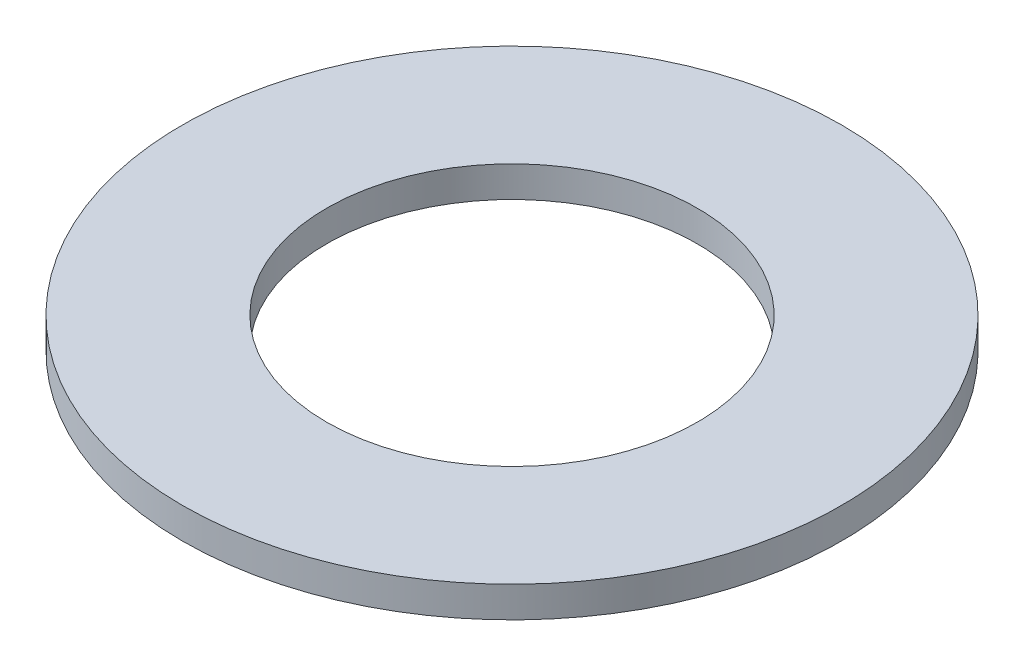
ISO-10303-21;
HEADER;
FILE_DESCRIPTION(('STEP AP214'),'2;1');
FILE_NAME('part.step','',(''),(''),'','','');
FILE_SCHEMA(('AUTOMOTIVE_DESIGN { 1 0 10303 214 1 1 1 1 }'));
ENDSEC;
DATA;
#1=APPLICATION_CONTEXT('core data for automotive mechanical design processes');
#2=APPLICATION_PROTOCOL_DEFINITION('international standard','automotive_design',2000,#1);
#3=PRODUCT_CONTEXT('',#1,'mechanical');
#4=PRODUCT('Part','Part','',(#3));
#5=PRODUCT_RELATED_PRODUCT_CATEGORY('part','',(#4));
#6=PRODUCT_DEFINITION_FORMATION('','',#4);
#7=PRODUCT_DEFINITION_CONTEXT('part definition',#1,'design');
#8=PRODUCT_DEFINITION('design','',#6,#7);
#9=PRODUCT_DEFINITION_SHAPE('','',#8);
#10=(LENGTH_UNIT() NAMED_UNIT(*) SI_UNIT(.MILLI.,.METRE.));
#11=(NAMED_UNIT(*) PLANE_ANGLE_UNIT() SI_UNIT($,.RADIAN.));
#12=(NAMED_UNIT(*) SI_UNIT($,.STERADIAN.) SOLID_ANGLE_UNIT());
#13=UNCERTAINTY_MEASURE_WITH_UNIT(LENGTH_MEASURE(1.E-05),#10,'distance_accuracy_value','');
#14=(GEOMETRIC_REPRESENTATION_CONTEXT(3) GLOBAL_UNCERTAINTY_ASSIGNED_CONTEXT((#13)) GLOBAL_UNIT_ASSIGNED_CONTEXT((#10,
#11,#12)) REPRESENTATION_CONTEXT('',''));
#15=CARTESIAN_POINT('',(0.,0.,0.));
#16=DIRECTION('',(0.,0.,1.));
#17=DIRECTION('',(1.,0.,0.));
#18=AXIS2_PLACEMENT_3D('',#15,#16,#17);
#19=CARTESIAN_POINT('',(0.,1.5,0.));
#20=DIRECTION('',(0.,1.,0.));
#21=DIRECTION('',(0.,0.,1.));
#22=AXIS2_PLACEMENT_3D('',#19,#20,#21);
#23=PLANE('',#22);
#24=CARTESIAN_POINT('',(0.,1.5,0.));
#25=DIRECTION('',(0.,1.,0.));
#26=DIRECTION('',(0.,0.,1.));
#27=AXIS2_PLACEMENT_3D('',#24,#25,#26);
#28=CIRCLE('',#27,16.);
#29=CARTESIAN_POINT('',(0.,1.5,16.));
#30=VERTEX_POINT('',#29);
#31=EDGE_CURVE('E10',#30,#30,#28,.T.);
#32=ORIENTED_EDGE('',*,*,#31,.T.);
#33=EDGE_LOOP('',(#32));
#34=FACE_BOUND('',#33,.T.);
#35=CARTESIAN_POINT('',(0.,1.5,0.));
#36=DIRECTION('',(0.,1.,0.));
#37=DIRECTION('',(0.,0.,1.));
#38=AXIS2_PLACEMENT_3D('',#35,#36,#37);
#39=CIRCLE('',#38,9.);
#40=CARTESIAN_POINT('',(0.,1.5,9.));
#41=VERTEX_POINT('',#40);
#42=EDGE_CURVE('E56',#41,#41,#39,.T.);
#43=ORIENTED_EDGE('',*,*,#42,.F.);
#44=EDGE_LOOP('',(#43));
#45=FACE_BOUND('',#44,.T.);
#46=ADVANCED_FACE('F43',(#34,#45),#23,.T.);
#47=CARTESIAN_POINT('',(0.,0.,0.));
#48=DIRECTION('',(0.,1.,0.));
#49=DIRECTION('',(0.,0.,1.));
#50=AXIS2_PLACEMENT_3D('',#47,#48,#49);
#51=PLANE('',#50);
#52=CARTESIAN_POINT('',(0.,0.,0.));
#53=DIRECTION('',(0.,1.,0.));
#54=DIRECTION('',(0.,0.,1.));
#55=AXIS2_PLACEMENT_3D('',#52,#53,#54);
#56=CIRCLE('',#55,16.);
#57=CARTESIAN_POINT('',(0.,0.,16.));
#58=VERTEX_POINT('',#57);
#59=EDGE_CURVE('E47',#58,#58,#56,.T.);
#60=ORIENTED_EDGE('',*,*,#59,.F.);
#61=EDGE_LOOP('',(#60));
#62=FACE_BOUND('',#61,.T.);
#63=CARTESIAN_POINT('',(0.,0.,0.));
#64=DIRECTION('',(0.,1.,0.));
#65=DIRECTION('',(0.,0.,1.));
#66=AXIS2_PLACEMENT_3D('',#63,#64,#65);
#67=CIRCLE('',#66,9.);
#68=CARTESIAN_POINT('',(0.,0.,9.));
#69=VERTEX_POINT('',#68);
#70=EDGE_CURVE('E58',#69,#69,#67,.T.);
#71=ORIENTED_EDGE('',*,*,#70,.T.);
#72=EDGE_LOOP('',(#71));
#73=FACE_BOUND('',#72,.T.);
#74=ADVANCED_FACE('F70',(#62,#73),#51,.F.);
#75=CARTESIAN_POINT('',(0.,1.5,0.));
#76=DIRECTION('',(0.,-1.,0.));
#77=DIRECTION('',(0.,0.,-1.));
#78=AXIS2_PLACEMENT_3D('',#75,#76,#77);
#79=CYLINDRICAL_SURFACE('',#78,16.);
#80=ORIENTED_EDGE('',*,*,#31,.F.);
#81=EDGE_LOOP('',(#80));
#82=FACE_BOUND('',#81,.T.);
#83=ORIENTED_EDGE('',*,*,#59,.T.);
#84=EDGE_LOOP('',(#83));
#85=FACE_BOUND('',#84,.T.);
#86=ADVANCED_FACE('F45',(#82,#85),#79,.T.);
#87=CARTESIAN_POINT('',(0.,1.5,0.));
#88=DIRECTION('',(0.,-1.,0.));
#89=DIRECTION('',(0.,0.,-1.));
#90=AXIS2_PLACEMENT_3D('',#87,#88,#89);
#91=CYLINDRICAL_SURFACE('',#90,9.);
#92=ORIENTED_EDGE('',*,*,#42,.T.);
#93=EDGE_LOOP('',(#92));
#94=FACE_BOUND('',#93,.T.);
#95=ORIENTED_EDGE('',*,*,#70,.F.);
#96=EDGE_LOOP('',(#95));
#97=FACE_BOUND('',#96,.T.);
#98=ADVANCED_FACE('F66',(#94,#97),#91,.F.);
#99=CLOSED_SHELL('',(#46,#74,#86,#98));
#100=MANIFOLD_SOLID_BREP('B2',#99);
#101=ADVANCED_BREP_SHAPE_REPRESENTATION('',(#18,#100),#14);
#102=SHAPE_DEFINITION_REPRESENTATION(#9,#101);
ENDSEC;
END-ISO-10303-21;
